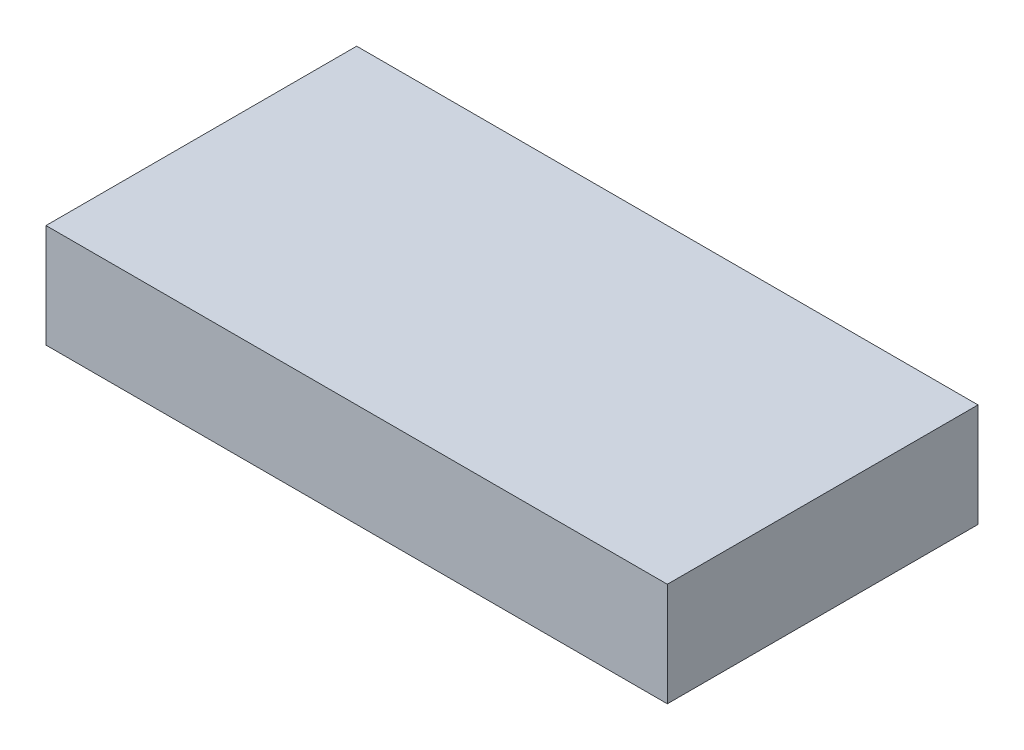
ISO-10303-21;
HEADER;
FILE_DESCRIPTION(('STEP AP214'),'2;1');
FILE_NAME('part.step','',(''),(''),'','','');
FILE_SCHEMA(('AUTOMOTIVE_DESIGN { 1 0 10303 214 1 1 1 1 }'));
ENDSEC;
DATA;
#1=APPLICATION_CONTEXT('core data for automotive mechanical design processes');
#2=APPLICATION_PROTOCOL_DEFINITION('international standard','automotive_design',2000,#1);
#3=PRODUCT_CONTEXT('',#1,'mechanical');
#4=PRODUCT('Part','Part','',(#3));
#5=PRODUCT_RELATED_PRODUCT_CATEGORY('part','',(#4));
#6=PRODUCT_DEFINITION_FORMATION('','',#4);
#7=PRODUCT_DEFINITION_CONTEXT('part definition',#1,'design');
#8=PRODUCT_DEFINITION('design','',#6,#7);
#9=PRODUCT_DEFINITION_SHAPE('','',#8);
#10=(LENGTH_UNIT() NAMED_UNIT(*) SI_UNIT(.MILLI.,.METRE.));
#11=(NAMED_UNIT(*) PLANE_ANGLE_UNIT() SI_UNIT($,.RADIAN.));
#12=(NAMED_UNIT(*) SI_UNIT($,.STERADIAN.) SOLID_ANGLE_UNIT());
#13=UNCERTAINTY_MEASURE_WITH_UNIT(LENGTH_MEASURE(1.E-05),#10,'distance_accuracy_value','');
#14=(GEOMETRIC_REPRESENTATION_CONTEXT(3) GLOBAL_UNCERTAINTY_ASSIGNED_CONTEXT((#13)) GLOBAL_UNIT_ASSIGNED_CONTEXT((#10,
#11,#12)) REPRESENTATION_CONTEXT('',''));
#15=CARTESIAN_POINT('',(0.,0.,0.));
#16=DIRECTION('',(0.,0.,1.));
#17=DIRECTION('',(1.,0.,0.));
#18=AXIS2_PLACEMENT_3D('',#15,#16,#17);
#19=CARTESIAN_POINT('',(-152.4,50.8,-76.2));
#20=DIRECTION('',(1.,0.,0.));
#21=DIRECTION('',(0.,0.,-1.));
#22=AXIS2_PLACEMENT_3D('',#19,#20,#21);
#23=PLANE('',#22);
#24=DIRECTION('',(0.,0.,1.));
#25=VECTOR('',#24,1.);
#26=CARTESIAN_POINT('',(-152.4,0.,-76.2));
#27=LINE('',#26,#25);
#28=CARTESIAN_POINT('',(-152.4,0.,-76.2));
#29=VERTEX_POINT('',#28);
#30=CARTESIAN_POINT('',(-152.4,0.,76.2));
#31=VERTEX_POINT('',#30);
#32=EDGE_CURVE('E96',#29,#31,#27,.T.);
#33=ORIENTED_EDGE('',*,*,#32,.T.);
#34=DIRECTION('',(0.,-1.,0.));
#35=VECTOR('',#34,1.);
#36=CARTESIAN_POINT('',(-152.4,50.8,76.2));
#37=LINE('',#36,#35);
#38=CARTESIAN_POINT('',(-152.4,50.8,76.2));
#39=VERTEX_POINT('',#38);
#40=EDGE_CURVE('E11',#39,#31,#37,.T.);
#41=ORIENTED_EDGE('',*,*,#40,.F.);
#42=DIRECTION('',(0.,0.,1.));
#43=VECTOR('',#42,1.);
#44=CARTESIAN_POINT('',(-152.4,50.8,-76.2));
#45=LINE('',#44,#43);
#46=CARTESIAN_POINT('',(-152.4,50.8,-76.2));
#47=VERTEX_POINT('',#46);
#48=EDGE_CURVE('E84',#47,#39,#45,.T.);
#49=ORIENTED_EDGE('',*,*,#48,.F.);
#50=DIRECTION('',(0.,-1.,0.));
#51=VECTOR('',#50,1.);
#52=CARTESIAN_POINT('',(-152.4,50.8,-76.2));
#53=LINE('',#52,#51);
#54=EDGE_CURVE('E92',#47,#29,#53,.T.);
#55=ORIENTED_EDGE('',*,*,#54,.T.);
#56=EDGE_LOOP('',(#33,#41,#49,#55));
#57=FACE_BOUND('',#56,.T.);
#58=ADVANCED_FACE('F33',(#57),#23,.F.);
#59=CARTESIAN_POINT('',(-152.4,50.8,76.2));
#60=DIRECTION('',(0.,0.,-1.));
#61=DIRECTION('',(-1.,0.,0.));
#62=AXIS2_PLACEMENT_3D('',#59,#60,#61);
#63=PLANE('',#62);
#64=DIRECTION('',(1.,0.,0.));
#65=VECTOR('',#64,1.);
#66=CARTESIAN_POINT('',(-152.4,0.,76.2));
#67=LINE('',#66,#65);
#68=CARTESIAN_POINT('',(152.4,0.,76.2));
#69=VERTEX_POINT('',#68);
#70=EDGE_CURVE('E88',#31,#69,#67,.T.);
#71=ORIENTED_EDGE('',*,*,#70,.T.);
#72=DIRECTION('',(0.,-1.,0.));
#73=VECTOR('',#72,1.);
#74=CARTESIAN_POINT('',(152.4,50.8,76.2));
#75=LINE('',#74,#73);
#76=CARTESIAN_POINT('',(152.4,50.8,76.2));
#77=VERTEX_POINT('',#76);
#78=EDGE_CURVE('E41',#77,#69,#75,.T.);
#79=ORIENTED_EDGE('',*,*,#78,.F.);
#80=DIRECTION('',(1.,0.,0.));
#81=VECTOR('',#80,1.);
#82=CARTESIAN_POINT('',(-152.4,50.8,76.2));
#83=LINE('',#82,#81);
#84=EDGE_CURVE('E79',#39,#77,#83,.T.);
#85=ORIENTED_EDGE('',*,*,#84,.F.);
#86=ORIENTED_EDGE('',*,*,#40,.T.);
#87=EDGE_LOOP('',(#71,#79,#85,#86));
#88=FACE_BOUND('',#87,.T.);
#89=ADVANCED_FACE('F87',(#88),#63,.F.);
#90=CARTESIAN_POINT('',(152.4,50.8,-76.2));
#91=DIRECTION('',(-1.,0.,0.));
#92=DIRECTION('',(0.,0.,1.));
#93=AXIS2_PLACEMENT_3D('',#90,#91,#92);
#94=PLANE('',#93);
#95=DIRECTION('',(0.,0.,-1.));
#96=VECTOR('',#95,1.);
#97=CARTESIAN_POINT('',(152.4,0.,-76.2));
#98=LINE('',#97,#96);
#99=CARTESIAN_POINT('',(152.4,0.,-76.2));
#100=VERTEX_POINT('',#99);
#101=EDGE_CURVE('E66',#69,#100,#98,.T.);
#102=ORIENTED_EDGE('',*,*,#101,.T.);
#103=DIRECTION('',(0.,-1.,0.));
#104=VECTOR('',#103,1.);
#105=CARTESIAN_POINT('',(152.4,50.8,-76.2));
#106=LINE('',#105,#104);
#107=CARTESIAN_POINT('',(152.4,50.8,-76.2));
#108=VERTEX_POINT('',#107);
#109=EDGE_CURVE('E89',#108,#100,#106,.T.);
#110=ORIENTED_EDGE('',*,*,#109,.F.);
#111=DIRECTION('',(0.,0.,-1.));
#112=VECTOR('',#111,1.);
#113=CARTESIAN_POINT('',(152.4,50.8,-76.2));
#114=LINE('',#113,#112);
#115=EDGE_CURVE('E82',#77,#108,#114,.T.);
#116=ORIENTED_EDGE('',*,*,#115,.F.);
#117=ORIENTED_EDGE('',*,*,#78,.T.);
#118=EDGE_LOOP('',(#102,#110,#116,#117));
#119=FACE_BOUND('',#118,.T.);
#120=ADVANCED_FACE('F90',(#119),#94,.F.);
#121=CARTESIAN_POINT('',(-152.4,50.8,-76.2));
#122=DIRECTION('',(0.,0.,1.));
#123=DIRECTION('',(1.,0.,0.));
#124=AXIS2_PLACEMENT_3D('',#121,#122,#123);
#125=PLANE('',#124);
#126=DIRECTION('',(-1.,0.,0.));
#127=VECTOR('',#126,1.);
#128=CARTESIAN_POINT('',(-152.4,0.,-76.2));
#129=LINE('',#128,#127);
#130=EDGE_CURVE('E72',#100,#29,#129,.T.);
#131=ORIENTED_EDGE('',*,*,#130,.T.);
#132=ORIENTED_EDGE('',*,*,#54,.F.);
#133=DIRECTION('',(-1.,0.,0.));
#134=VECTOR('',#133,1.);
#135=CARTESIAN_POINT('',(-152.4,50.8,-76.2));
#136=LINE('',#135,#134);
#137=EDGE_CURVE('E49',#108,#47,#136,.T.);
#138=ORIENTED_EDGE('',*,*,#137,.F.);
#139=ORIENTED_EDGE('',*,*,#109,.T.);
#140=EDGE_LOOP('',(#131,#132,#138,#139));
#141=FACE_BOUND('',#140,.T.);
#142=ADVANCED_FACE('F103',(#141),#125,.F.);
#143=CARTESIAN_POINT('',(0.,50.8,0.));
#144=DIRECTION('',(0.,1.,0.));
#145=DIRECTION('',(0.,0.,1.));
#146=AXIS2_PLACEMENT_3D('',#143,#144,#145);
#147=PLANE('',#146);
#148=ORIENTED_EDGE('',*,*,#48,.T.);
#149=ORIENTED_EDGE('',*,*,#84,.T.);
#150=ORIENTED_EDGE('',*,*,#115,.T.);
#151=ORIENTED_EDGE('',*,*,#137,.T.);
#152=EDGE_LOOP('',(#148,#149,#150,#151));
#153=FACE_BOUND('',#152,.T.);
#154=ADVANCED_FACE('F80',(#153),#147,.T.);
#155=CARTESIAN_POINT('',(0.,0.,0.));
#156=DIRECTION('',(0.,1.,0.));
#157=DIRECTION('',(0.,0.,1.));
#158=AXIS2_PLACEMENT_3D('',#155,#156,#157);
#159=PLANE('',#158);
#160=ORIENTED_EDGE('',*,*,#32,.F.);
#161=ORIENTED_EDGE('',*,*,#130,.F.);
#162=ORIENTED_EDGE('',*,*,#101,.F.);
#163=ORIENTED_EDGE('',*,*,#70,.F.);
#164=EDGE_LOOP('',(#160,#161,#162,#163));
#165=FACE_BOUND('',#164,.T.);
#166=ADVANCED_FACE('F106',(#165),#159,.F.);
#167=CLOSED_SHELL('',(#58,#89,#120,#142,#154,#166));
#168=MANIFOLD_SOLID_BREP('B2',#167);
#169=ADVANCED_BREP_SHAPE_REPRESENTATION('',(#18,#168),#14);
#170=SHAPE_DEFINITION_REPRESENTATION(#9,#169);
ENDSEC;
END-ISO-10303-21;
